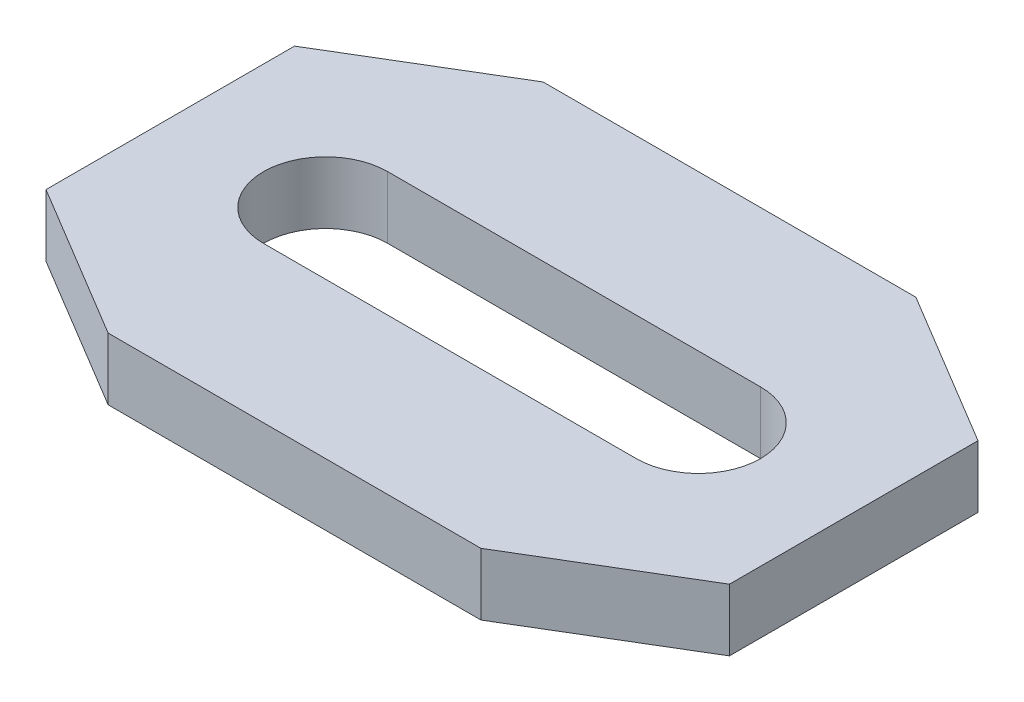
ISO-10303-21;
HEADER;
FILE_DESCRIPTION(('STEP AP214'),'2;1');
FILE_NAME('part.step','',(''),(''),'','','');
FILE_SCHEMA(('AUTOMOTIVE_DESIGN { 1 0 10303 214 1 1 1 1 }'));
ENDSEC;
DATA;
#1=APPLICATION_CONTEXT('core data for automotive mechanical design processes');
#2=APPLICATION_PROTOCOL_DEFINITION('international standard','automotive_design',2000,#1);
#3=PRODUCT_CONTEXT('',#1,'mechanical');
#4=PRODUCT('Part','Part','',(#3));
#5=PRODUCT_RELATED_PRODUCT_CATEGORY('part','',(#4));
#6=PRODUCT_DEFINITION_FORMATION('','',#4);
#7=PRODUCT_DEFINITION_CONTEXT('part definition',#1,'design');
#8=PRODUCT_DEFINITION('design','',#6,#7);
#9=PRODUCT_DEFINITION_SHAPE('','',#8);
#10=(LENGTH_UNIT() NAMED_UNIT(*) SI_UNIT(.MILLI.,.METRE.));
#11=(NAMED_UNIT(*) PLANE_ANGLE_UNIT() SI_UNIT($,.RADIAN.));
#12=(NAMED_UNIT(*) SI_UNIT($,.STERADIAN.) SOLID_ANGLE_UNIT());
#13=UNCERTAINTY_MEASURE_WITH_UNIT(LENGTH_MEASURE(1.E-05),#10,'distance_accuracy_value','');
#14=(GEOMETRIC_REPRESENTATION_CONTEXT(3) GLOBAL_UNCERTAINTY_ASSIGNED_CONTEXT((#13)) GLOBAL_UNIT_ASSIGNED_CONTEXT((#10,
#11,#12)) REPRESENTATION_CONTEXT('',''));
#15=CARTESIAN_POINT('',(0.,0.,0.));
#16=DIRECTION('',(0.,0.,1.));
#17=DIRECTION('',(1.,0.,0.));
#18=AXIS2_PLACEMENT_3D('',#15,#16,#17);
#19=CARTESIAN_POINT('',(0.,12.7,0.));
#20=DIRECTION('',(0.,1.,0.));
#21=DIRECTION('',(0.,0.,1.));
#22=AXIS2_PLACEMENT_3D('',#19,#20,#21);
#23=PLANE('',#22);
#24=DIRECTION('',(-1.,0.,0.));
#25=VECTOR('',#24,1.);
#26=CARTESIAN_POINT('',(76.2,12.7,-44.45));
#27=LINE('',#26,#25);
#28=CARTESIAN_POINT('',(76.2,12.7,-44.45));
#29=VERTEX_POINT('',#28);
#30=CARTESIAN_POINT('',(0.,12.7,-44.45));
#31=VERTEX_POINT('',#30);
#32=EDGE_CURVE('E178',#29,#31,#27,.T.);
#33=ORIENTED_EDGE('',*,*,#32,.T.);
#34=DIRECTION('',(-0.857492925712544,0.,0.514495755427527));
#35=VECTOR('',#34,1.);
#36=CARTESIAN_POINT('',(0.,12.7,-44.45));
#37=LINE('',#36,#35);
#38=CARTESIAN_POINT('',(-31.75,12.7,-25.4));
#39=VERTEX_POINT('',#38);
#40=EDGE_CURVE('E182',#31,#39,#37,.T.);
#41=ORIENTED_EDGE('',*,*,#40,.T.);
#42=DIRECTION('',(0.,0.,1.));
#43=VECTOR('',#42,1.);
#44=CARTESIAN_POINT('',(-31.75,12.7,-25.4));
#45=LINE('',#44,#43);
#46=CARTESIAN_POINT('',(-31.75,12.7,25.4));
#47=VERTEX_POINT('',#46);
#48=EDGE_CURVE('E186',#39,#47,#45,.T.);
#49=ORIENTED_EDGE('',*,*,#48,.T.);
#50=DIRECTION('',(0.857492925712544,0.,0.514495755427526));
#51=VECTOR('',#50,1.);
#52=CARTESIAN_POINT('',(-31.75,12.7,25.4));
#53=LINE('',#52,#51);
#54=CARTESIAN_POINT('',(0.,12.7,44.45));
#55=VERTEX_POINT('',#54);
#56=EDGE_CURVE('E189',#47,#55,#53,.T.);
#57=ORIENTED_EDGE('',*,*,#56,.T.);
#58=DIRECTION('',(1.,0.,0.));
#59=VECTOR('',#58,1.);
#60=CARTESIAN_POINT('',(0.,12.7,44.45));
#61=LINE('',#60,#59);
#62=CARTESIAN_POINT('',(76.2,12.7,44.45));
#63=VERTEX_POINT('',#62);
#64=EDGE_CURVE('E192',#55,#63,#61,.T.);
#65=ORIENTED_EDGE('',*,*,#64,.T.);
#66=DIRECTION('',(0.857492925712544,0.,-0.514495755427527));
#67=VECTOR('',#66,1.);
#68=CARTESIAN_POINT('',(76.2,12.7,44.45));
#69=LINE('',#68,#67);
#70=CARTESIAN_POINT('',(107.95,12.7,25.4));
#71=VERTEX_POINT('',#70);
#72=EDGE_CURVE('E195',#63,#71,#69,.T.);
#73=ORIENTED_EDGE('',*,*,#72,.T.);
#74=DIRECTION('',(0.,0.,-1.));
#75=VECTOR('',#74,1.);
#76=CARTESIAN_POINT('',(107.95,12.7,25.4));
#77=LINE('',#76,#75);
#78=CARTESIAN_POINT('',(107.95,12.7,-25.4));
#79=VERTEX_POINT('',#78);
#80=EDGE_CURVE('E198',#71,#79,#77,.T.);
#81=ORIENTED_EDGE('',*,*,#80,.T.);
#82=DIRECTION('',(-0.857492925712544,0.,-0.514495755427526));
#83=VECTOR('',#82,1.);
#84=CARTESIAN_POINT('',(107.95,12.7,-25.4));
#85=LINE('',#84,#83);
#86=EDGE_CURVE('E201',#79,#29,#85,.T.);
#87=ORIENTED_EDGE('',*,*,#86,.T.);
#88=EDGE_LOOP('',(#33,#41,#49,#57,#65,#73,#81,#87));
#89=FACE_BOUND('',#88,.T.);
#90=DIRECTION('',(1.,0.,0.));
#91=VECTOR('',#90,1.);
#92=CARTESIAN_POINT('',(0.,12.7,12.7));
#93=LINE('',#92,#91);
#94=CARTESIAN_POINT('',(0.,12.7,12.7));
#95=VERTEX_POINT('',#94);
#96=CARTESIAN_POINT('',(76.2,12.7,12.7));
#97=VERTEX_POINT('',#96);
#98=EDGE_CURVE('E139',#95,#97,#93,.T.);
#99=ORIENTED_EDGE('',*,*,#98,.F.);
#100=CARTESIAN_POINT('',(0.,12.7,0.));
#101=DIRECTION('',(0.,1.,0.));
#102=DIRECTION('',(0.,0.,1.));
#103=AXIS2_PLACEMENT_3D('',#100,#101,#102);
#104=CIRCLE('',#103,12.7);
#105=CARTESIAN_POINT('',(0.,12.7,-12.7));
#106=VERTEX_POINT('',#105);
#107=EDGE_CURVE('E130',#106,#95,#104,.T.);
#108=ORIENTED_EDGE('',*,*,#107,.F.);
#109=DIRECTION('',(-1.,0.,0.));
#110=VECTOR('',#109,1.);
#111=CARTESIAN_POINT('',(0.,12.7,-12.7));
#112=LINE('',#111,#110);
#113=CARTESIAN_POINT('',(76.2,12.7,-12.7));
#114=VERTEX_POINT('',#113);
#115=EDGE_CURVE('E156',#114,#106,#112,.T.);
#116=ORIENTED_EDGE('',*,*,#115,.F.);
#117=CARTESIAN_POINT('',(76.2,12.7,0.));
#118=DIRECTION('',(0.,1.,0.));
#119=DIRECTION('',(0.,0.,1.));
#120=AXIS2_PLACEMENT_3D('',#117,#118,#119);
#121=CIRCLE('',#120,12.7);
#122=EDGE_CURVE('E152',#97,#114,#121,.T.);
#123=ORIENTED_EDGE('',*,*,#122,.F.);
#124=EDGE_LOOP('',(#99,#108,#116,#123));
#125=FACE_BOUND('',#124,.T.);
#126=ADVANCED_FACE('F40',(#89,#125),#23,.T.);
#127=CARTESIAN_POINT('',(0.,0.,0.));
#128=DIRECTION('',(0.,1.,0.));
#129=DIRECTION('',(0.,0.,1.));
#130=AXIS2_PLACEMENT_3D('',#127,#128,#129);
#131=PLANE('',#130);
#132=DIRECTION('',(-1.,0.,0.));
#133=VECTOR('',#132,1.);
#134=CARTESIAN_POINT('',(76.2,0.,-44.45));
#135=LINE('',#134,#133);
#136=CARTESIAN_POINT('',(76.2,0.,-44.45));
#137=VERTEX_POINT('',#136);
#138=CARTESIAN_POINT('',(0.,0.,-44.45));
#139=VERTEX_POINT('',#138);
#140=EDGE_CURVE('E148',#137,#139,#135,.T.);
#141=ORIENTED_EDGE('',*,*,#140,.F.);
#142=DIRECTION('',(-0.857492925712544,0.,-0.514495755427526));
#143=VECTOR('',#142,1.);
#144=CARTESIAN_POINT('',(107.95,0.,-25.4));
#145=LINE('',#144,#143);
#146=CARTESIAN_POINT('',(107.95,0.,-25.4));
#147=VERTEX_POINT('',#146);
#148=EDGE_CURVE('E183',#147,#137,#145,.T.);
#149=ORIENTED_EDGE('',*,*,#148,.F.);
#150=DIRECTION('',(0.,0.,-1.));
#151=VECTOR('',#150,1.);
#152=CARTESIAN_POINT('',(107.95,0.,25.4));
#153=LINE('',#152,#151);
#154=CARTESIAN_POINT('',(107.95,0.,25.4));
#155=VERTEX_POINT('',#154);
#156=EDGE_CURVE('E223',#155,#147,#153,.T.);
#157=ORIENTED_EDGE('',*,*,#156,.F.);
#158=DIRECTION('',(0.857492925712544,0.,-0.514495755427527));
#159=VECTOR('',#158,1.);
#160=CARTESIAN_POINT('',(76.2,0.,44.45));
#161=LINE('',#160,#159);
#162=CARTESIAN_POINT('',(76.2,0.,44.45));
#163=VERTEX_POINT('',#162);
#164=EDGE_CURVE('E220',#163,#155,#161,.T.);
#165=ORIENTED_EDGE('',*,*,#164,.F.);
#166=DIRECTION('',(1.,0.,0.));
#167=VECTOR('',#166,1.);
#168=CARTESIAN_POINT('',(0.,0.,44.45));
#169=LINE('',#168,#167);
#170=CARTESIAN_POINT('',(0.,0.,44.45));
#171=VERTEX_POINT('',#170);
#172=EDGE_CURVE('E217',#171,#163,#169,.T.);
#173=ORIENTED_EDGE('',*,*,#172,.F.);
#174=DIRECTION('',(0.857492925712544,0.,0.514495755427526));
#175=VECTOR('',#174,1.);
#176=CARTESIAN_POINT('',(-31.75,0.,25.4));
#177=LINE('',#176,#175);
#178=CARTESIAN_POINT('',(-31.75,0.,25.4));
#179=VERTEX_POINT('',#178);
#180=EDGE_CURVE('E214',#179,#171,#177,.T.);
#181=ORIENTED_EDGE('',*,*,#180,.F.);
#182=DIRECTION('',(0.,0.,1.));
#183=VECTOR('',#182,1.);
#184=CARTESIAN_POINT('',(-31.75,0.,-25.4));
#185=LINE('',#184,#183);
#186=CARTESIAN_POINT('',(-31.75,0.,-25.4));
#187=VERTEX_POINT('',#186);
#188=EDGE_CURVE('E211',#187,#179,#185,.T.);
#189=ORIENTED_EDGE('',*,*,#188,.F.);
#190=DIRECTION('',(-0.857492925712544,0.,0.514495755427527));
#191=VECTOR('',#190,1.);
#192=CARTESIAN_POINT('',(0.,0.,-44.45));
#193=LINE('',#192,#191);
#194=EDGE_CURVE('E208',#139,#187,#193,.T.);
#195=ORIENTED_EDGE('',*,*,#194,.F.);
#196=EDGE_LOOP('',(#141,#149,#157,#165,#173,#181,#189,#195));
#197=FACE_BOUND('',#196,.T.);
#198=CARTESIAN_POINT('',(0.,0.,0.));
#199=DIRECTION('',(0.,1.,0.));
#200=DIRECTION('',(0.,0.,1.));
#201=AXIS2_PLACEMENT_3D('',#198,#199,#200);
#202=CIRCLE('',#201,12.7);
#203=CARTESIAN_POINT('',(0.,0.,-12.7));
#204=VERTEX_POINT('',#203);
#205=CARTESIAN_POINT('',(0.,0.,12.7));
#206=VERTEX_POINT('',#205);
#207=EDGE_CURVE('E64',#204,#206,#202,.T.);
#208=ORIENTED_EDGE('',*,*,#207,.T.);
#209=DIRECTION('',(1.,0.,0.));
#210=VECTOR('',#209,1.);
#211=CARTESIAN_POINT('',(0.,0.,12.7));
#212=LINE('',#211,#210);
#213=CARTESIAN_POINT('',(76.2,0.,12.7));
#214=VERTEX_POINT('',#213);
#215=EDGE_CURVE('E146',#206,#214,#212,.T.);
#216=ORIENTED_EDGE('',*,*,#215,.T.);
#217=CARTESIAN_POINT('',(76.2,0.,0.));
#218=DIRECTION('',(0.,1.,0.));
#219=DIRECTION('',(0.,0.,1.));
#220=AXIS2_PLACEMENT_3D('',#217,#218,#219);
#221=CIRCLE('',#220,12.7);
#222=CARTESIAN_POINT('',(76.2,0.,-12.7));
#223=VERTEX_POINT('',#222);
#224=EDGE_CURVE('E165',#214,#223,#221,.T.);
#225=ORIENTED_EDGE('',*,*,#224,.T.);
#226=DIRECTION('',(-1.,0.,0.));
#227=VECTOR('',#226,1.);
#228=CARTESIAN_POINT('',(0.,0.,-12.7));
#229=LINE('',#228,#227);
#230=EDGE_CURVE('E140',#223,#204,#229,.T.);
#231=ORIENTED_EDGE('',*,*,#230,.T.);
#232=EDGE_LOOP('',(#208,#216,#225,#231));
#233=FACE_BOUND('',#232,.T.);
#234=ADVANCED_FACE('F262',(#197,#233),#131,.F.);
#235=CARTESIAN_POINT('',(76.2,12.7,-44.45));
#236=DIRECTION('',(0.,0.,1.));
#237=DIRECTION('',(1.,0.,0.));
#238=AXIS2_PLACEMENT_3D('',#235,#236,#237);
#239=PLANE('',#238);
#240=ORIENTED_EDGE('',*,*,#140,.T.);
#241=DIRECTION('',(0.,-1.,0.));
#242=VECTOR('',#241,1.);
#243=CARTESIAN_POINT('',(0.,12.7,-44.45));
#244=LINE('',#243,#242);
#245=EDGE_CURVE('E11',#31,#139,#244,.T.);
#246=ORIENTED_EDGE('',*,*,#245,.F.);
#247=ORIENTED_EDGE('',*,*,#32,.F.);
#248=DIRECTION('',(0.,-1.,0.));
#249=VECTOR('',#248,1.);
#250=CARTESIAN_POINT('',(76.2,12.7,-44.45));
#251=LINE('',#250,#249);
#252=EDGE_CURVE('E204',#29,#137,#251,.T.);
#253=ORIENTED_EDGE('',*,*,#252,.T.);
#254=EDGE_LOOP('',(#240,#246,#247,#253));
#255=FACE_BOUND('',#254,.T.);
#256=ADVANCED_FACE('F42',(#255),#239,.F.);
#257=CARTESIAN_POINT('',(0.,12.7,-44.45));
#258=DIRECTION('',(0.514495755427527,0.,0.857492925712544));
#259=DIRECTION('',(0.857492925712544,0.,-0.514495755427527));
#260=AXIS2_PLACEMENT_3D('',#257,#258,#259);
#261=PLANE('',#260);
#262=ORIENTED_EDGE('',*,*,#194,.T.);
#263=DIRECTION('',(0.,-1.,0.));
#264=VECTOR('',#263,1.);
#265=CARTESIAN_POINT('',(-31.75,12.7,-25.4));
#266=LINE('',#265,#264);
#267=EDGE_CURVE('E49',#39,#187,#266,.T.);
#268=ORIENTED_EDGE('',*,*,#267,.F.);
#269=ORIENTED_EDGE('',*,*,#40,.F.);
#270=ORIENTED_EDGE('',*,*,#245,.T.);
#271=EDGE_LOOP('',(#262,#268,#269,#270));
#272=FACE_BOUND('',#271,.T.);
#273=ADVANCED_FACE('F279',(#272),#261,.F.);
#274=CARTESIAN_POINT('',(-31.75,12.7,-25.4));
#275=DIRECTION('',(1.,0.,0.));
#276=DIRECTION('',(0.,0.,-1.));
#277=AXIS2_PLACEMENT_3D('',#274,#275,#276);
#278=PLANE('',#277);
#279=ORIENTED_EDGE('',*,*,#188,.T.);
#280=DIRECTION('',(0.,-1.,0.));
#281=VECTOR('',#280,1.);
#282=CARTESIAN_POINT('',(-31.75,12.7,25.4));
#283=LINE('',#282,#281);
#284=EDGE_CURVE('E247',#47,#179,#283,.T.);
#285=ORIENTED_EDGE('',*,*,#284,.F.);
#286=ORIENTED_EDGE('',*,*,#48,.F.);
#287=ORIENTED_EDGE('',*,*,#267,.T.);
#288=EDGE_LOOP('',(#279,#285,#286,#287));
#289=FACE_BOUND('',#288,.T.);
#290=ADVANCED_FACE('F256',(#289),#278,.F.);
#291=CARTESIAN_POINT('',(-31.75,12.7,25.4));
#292=DIRECTION('',(0.514495755427526,0.,-0.857492925712544));
#293=DIRECTION('',(-0.857492925712544,0.,-0.514495755427526));
#294=AXIS2_PLACEMENT_3D('',#291,#292,#293);
#295=PLANE('',#294);
#296=ORIENTED_EDGE('',*,*,#180,.T.);
#297=DIRECTION('',(0.,-1.,0.));
#298=VECTOR('',#297,1.);
#299=CARTESIAN_POINT('',(0.,12.7,44.45));
#300=LINE('',#299,#298);
#301=EDGE_CURVE('E243',#55,#171,#300,.T.);
#302=ORIENTED_EDGE('',*,*,#301,.F.);
#303=ORIENTED_EDGE('',*,*,#56,.F.);
#304=ORIENTED_EDGE('',*,*,#284,.T.);
#305=EDGE_LOOP('',(#296,#302,#303,#304));
#306=FACE_BOUND('',#305,.T.);
#307=ADVANCED_FACE('F268',(#306),#295,.F.);
#308=CARTESIAN_POINT('',(0.,12.7,44.45));
#309=DIRECTION('',(0.,0.,-1.));
#310=DIRECTION('',(-1.,0.,0.));
#311=AXIS2_PLACEMENT_3D('',#308,#309,#310);
#312=PLANE('',#311);
#313=ORIENTED_EDGE('',*,*,#172,.T.);
#314=DIRECTION('',(0.,-1.,0.));
#315=VECTOR('',#314,1.);
#316=CARTESIAN_POINT('',(76.2,12.7,44.45));
#317=LINE('',#316,#315);
#318=EDGE_CURVE('E239',#63,#163,#317,.T.);
#319=ORIENTED_EDGE('',*,*,#318,.F.);
#320=ORIENTED_EDGE('',*,*,#64,.F.);
#321=ORIENTED_EDGE('',*,*,#301,.T.);
#322=EDGE_LOOP('',(#313,#319,#320,#321));
#323=FACE_BOUND('',#322,.T.);
#324=ADVANCED_FACE('F272',(#323),#312,.F.);
#325=CARTESIAN_POINT('',(76.2,12.7,44.45));
#326=DIRECTION('',(-0.514495755427527,0.,-0.857492925712544));
#327=DIRECTION('',(-0.857492925712544,0.,0.514495755427527));
#328=AXIS2_PLACEMENT_3D('',#325,#326,#327);
#329=PLANE('',#328);
#330=ORIENTED_EDGE('',*,*,#164,.T.);
#331=DIRECTION('',(0.,-1.,0.));
#332=VECTOR('',#331,1.);
#333=CARTESIAN_POINT('',(107.95,12.7,25.4));
#334=LINE('',#333,#332);
#335=EDGE_CURVE('E235',#71,#155,#334,.T.);
#336=ORIENTED_EDGE('',*,*,#335,.F.);
#337=ORIENTED_EDGE('',*,*,#72,.F.);
#338=ORIENTED_EDGE('',*,*,#318,.T.);
#339=EDGE_LOOP('',(#330,#336,#337,#338));
#340=FACE_BOUND('',#339,.T.);
#341=ADVANCED_FACE('F292',(#340),#329,.F.);
#342=CARTESIAN_POINT('',(107.95,12.7,25.4));
#343=DIRECTION('',(-1.,0.,0.));
#344=DIRECTION('',(0.,0.,1.));
#345=AXIS2_PLACEMENT_3D('',#342,#343,#344);
#346=PLANE('',#345);
#347=ORIENTED_EDGE('',*,*,#156,.T.);
#348=DIRECTION('',(0.,-1.,0.));
#349=VECTOR('',#348,1.);
#350=CARTESIAN_POINT('',(107.95,12.7,-25.4));
#351=LINE('',#350,#349);
#352=EDGE_CURVE('E231',#79,#147,#351,.T.);
#353=ORIENTED_EDGE('',*,*,#352,.F.);
#354=ORIENTED_EDGE('',*,*,#80,.F.);
#355=ORIENTED_EDGE('',*,*,#335,.T.);
#356=EDGE_LOOP('',(#347,#353,#354,#355));
#357=FACE_BOUND('',#356,.T.);
#358=ADVANCED_FACE('F290',(#357),#346,.F.);
#359=CARTESIAN_POINT('',(107.95,12.7,-25.4));
#360=DIRECTION('',(-0.514495755427526,0.,0.857492925712544));
#361=DIRECTION('',(0.857492925712544,0.,0.514495755427526));
#362=AXIS2_PLACEMENT_3D('',#359,#360,#361);
#363=PLANE('',#362);
#364=ORIENTED_EDGE('',*,*,#148,.T.);
#365=ORIENTED_EDGE('',*,*,#252,.F.);
#366=ORIENTED_EDGE('',*,*,#86,.F.);
#367=ORIENTED_EDGE('',*,*,#352,.T.);
#368=EDGE_LOOP('',(#364,#365,#366,#367));
#369=FACE_BOUND('',#368,.T.);
#370=ADVANCED_FACE('F285',(#369),#363,.F.);
#371=CARTESIAN_POINT('',(0.,12.7,0.));
#372=DIRECTION('',(0.,-1.,0.));
#373=DIRECTION('',(0.,0.,-1.));
#374=AXIS2_PLACEMENT_3D('',#371,#372,#373);
#375=CYLINDRICAL_SURFACE('',#374,12.7);
#376=ORIENTED_EDGE('',*,*,#207,.F.);
#377=DIRECTION('',(0.,-1.,0.));
#378=VECTOR('',#377,1.);
#379=CARTESIAN_POINT('',(0.,12.7,-12.7));
#380=LINE('',#379,#378);
#381=EDGE_CURVE('E134',#106,#204,#380,.T.);
#382=ORIENTED_EDGE('',*,*,#381,.F.);
#383=ORIENTED_EDGE('',*,*,#107,.T.);
#384=DIRECTION('',(0.,-1.,0.));
#385=VECTOR('',#384,1.);
#386=CARTESIAN_POINT('',(0.,12.7,12.7));
#387=LINE('',#386,#385);
#388=EDGE_CURVE('E133',#95,#206,#387,.T.);
#389=ORIENTED_EDGE('',*,*,#388,.T.);
#390=EDGE_LOOP('',(#376,#382,#383,#389));
#391=FACE_BOUND('',#390,.T.);
#392=ADVANCED_FACE('F132',(#391),#375,.F.);
#393=CARTESIAN_POINT('',(0.,12.7,12.7));
#394=DIRECTION('',(0.,0.,-1.));
#395=DIRECTION('',(-1.,0.,0.));
#396=AXIS2_PLACEMENT_3D('',#393,#394,#395);
#397=PLANE('',#396);
#398=ORIENTED_EDGE('',*,*,#215,.F.);
#399=ORIENTED_EDGE('',*,*,#388,.F.);
#400=ORIENTED_EDGE('',*,*,#98,.T.);
#401=DIRECTION('',(0.,-1.,0.));
#402=VECTOR('',#401,1.);
#403=CARTESIAN_POINT('',(76.2,12.7,12.7));
#404=LINE('',#403,#402);
#405=EDGE_CURVE('E149',#97,#214,#404,.T.);
#406=ORIENTED_EDGE('',*,*,#405,.T.);
#407=EDGE_LOOP('',(#398,#399,#400,#406));
#408=FACE_BOUND('',#407,.T.);
#409=ADVANCED_FACE('F143',(#408),#397,.T.);
#410=CARTESIAN_POINT('',(76.2,12.7,0.));
#411=DIRECTION('',(0.,-1.,0.));
#412=DIRECTION('',(0.,0.,-1.));
#413=AXIS2_PLACEMENT_3D('',#410,#411,#412);
#414=CYLINDRICAL_SURFACE('',#413,12.7);
#415=ORIENTED_EDGE('',*,*,#224,.F.);
#416=ORIENTED_EDGE('',*,*,#405,.F.);
#417=ORIENTED_EDGE('',*,*,#122,.T.);
#418=DIRECTION('',(0.,-1.,0.));
#419=VECTOR('',#418,1.);
#420=CARTESIAN_POINT('',(76.2,12.7,-12.7));
#421=LINE('',#420,#419);
#422=EDGE_CURVE('E56',#114,#223,#421,.T.);
#423=ORIENTED_EDGE('',*,*,#422,.T.);
#424=EDGE_LOOP('',(#415,#416,#417,#423));
#425=FACE_BOUND('',#424,.T.);
#426=ADVANCED_FACE('F317',(#425),#414,.F.);
#427=CARTESIAN_POINT('',(0.,12.7,-12.7));
#428=DIRECTION('',(0.,0.,1.));
#429=DIRECTION('',(1.,0.,0.));
#430=AXIS2_PLACEMENT_3D('',#427,#428,#429);
#431=PLANE('',#430);
#432=ORIENTED_EDGE('',*,*,#230,.F.);
#433=ORIENTED_EDGE('',*,*,#422,.F.);
#434=ORIENTED_EDGE('',*,*,#115,.T.);
#435=ORIENTED_EDGE('',*,*,#381,.T.);
#436=EDGE_LOOP('',(#432,#433,#434,#435));
#437=FACE_BOUND('',#436,.T.);
#438=ADVANCED_FACE('F321',(#437),#431,.T.);
#439=CLOSED_SHELL('',(#126,#234,#256,#273,#290,#307,#324,#341,#358,#370,#392,#409,#426,#438));
#440=MANIFOLD_SOLID_BREP('B2',#439);
#441=ADVANCED_BREP_SHAPE_REPRESENTATION('',(#18,#440),#14);
#442=SHAPE_DEFINITION_REPRESENTATION(#9,#441);
ENDSEC;
END-ISO-10303-21;
